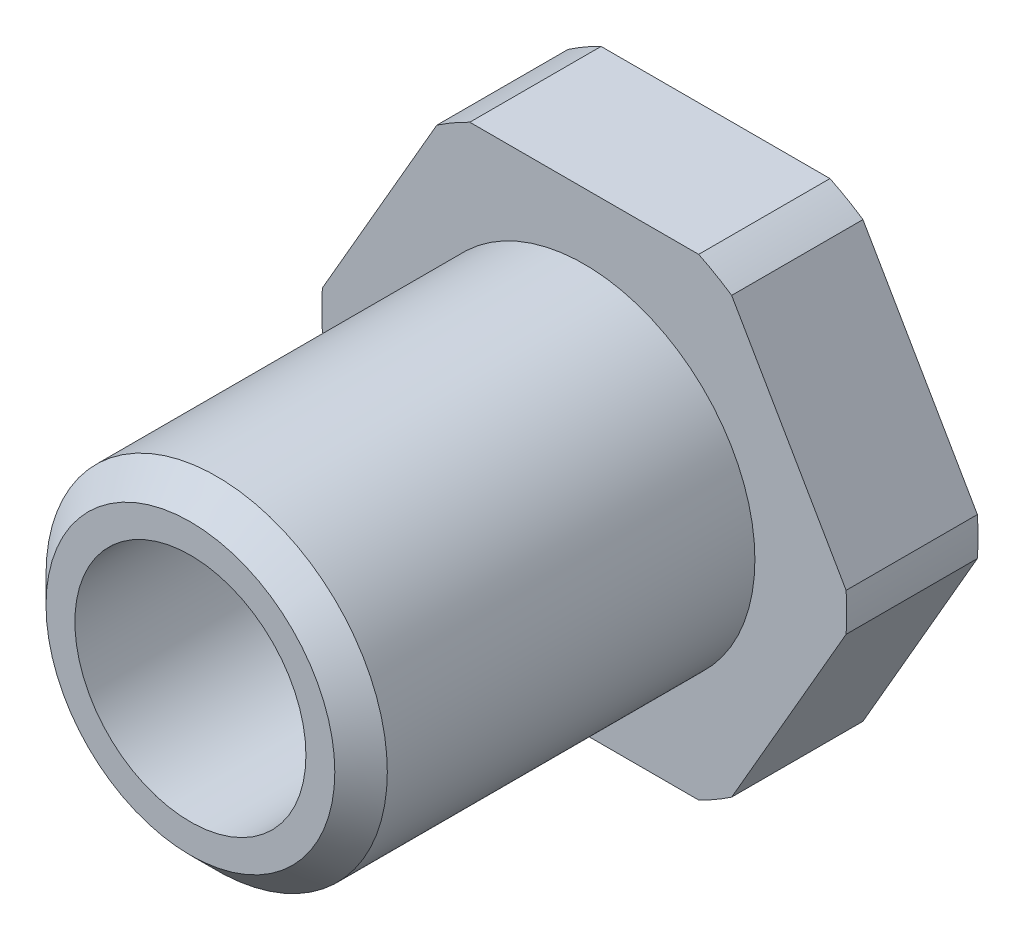
ISO-10303-21;
HEADER;
FILE_DESCRIPTION(('STEP AP214'),'2;1');
FILE_NAME('part.step','',(''),(''),'','','');
FILE_SCHEMA(('AUTOMOTIVE_DESIGN { 1 0 10303 214 1 1 1 1 }'));
ENDSEC;
DATA;
#1=APPLICATION_CONTEXT('core data for automotive mechanical design processes');
#2=APPLICATION_PROTOCOL_DEFINITION('international standard','automotive_design',2000,#1);
#3=PRODUCT_CONTEXT('',#1,'mechanical');
#4=PRODUCT('Part','Part','',(#3));
#5=PRODUCT_RELATED_PRODUCT_CATEGORY('part','',(#4));
#6=PRODUCT_DEFINITION_FORMATION('','',#4);
#7=PRODUCT_DEFINITION_CONTEXT('part definition',#1,'design');
#8=PRODUCT_DEFINITION('design','',#6,#7);
#9=PRODUCT_DEFINITION_SHAPE('','',#8);
#10=(LENGTH_UNIT() NAMED_UNIT(*) SI_UNIT(.MILLI.,.METRE.));
#11=(NAMED_UNIT(*) PLANE_ANGLE_UNIT() SI_UNIT($,.RADIAN.));
#12=(NAMED_UNIT(*) SI_UNIT($,.STERADIAN.) SOLID_ANGLE_UNIT());
#13=UNCERTAINTY_MEASURE_WITH_UNIT(LENGTH_MEASURE(1.E-05),#10,'distance_accuracy_value','');
#14=(GEOMETRIC_REPRESENTATION_CONTEXT(3) GLOBAL_UNCERTAINTY_ASSIGNED_CONTEXT((#13)) GLOBAL_UNIT_ASSIGNED_CONTEXT((#10,
#11,#12)) REPRESENTATION_CONTEXT('',''));
#15=CARTESIAN_POINT('',(0.,0.,0.));
#16=DIRECTION('',(0.,0.,1.));
#17=DIRECTION('',(1.,0.,0.));
#18=AXIS2_PLACEMENT_3D('',#15,#16,#17);
#19=CARTESIAN_POINT('',(10.3923048454133,0.,5.));
#20=DIRECTION('',(0.,0.,1.));
#21=DIRECTION('',(1.,0.,0.));
#22=AXIS2_PLACEMENT_3D('',#19,#20,#21);
#23=PLANE('',#22);
#24=CARTESIAN_POINT('',(0.,0.,5.));
#25=DIRECTION('',(0.,0.,1.));
#26=DIRECTION('',(1.,0.,0.));
#27=AXIS2_PLACEMENT_3D('',#24,#25,#26);
#28=CIRCLE('',#27,6.5);
#29=CARTESIAN_POINT('',(6.5,0.,5.));
#30=VERTEX_POINT('',#29);
#31=EDGE_CURVE('E154',#30,#30,#28,.T.);
#32=ORIENTED_EDGE('',*,*,#31,.F.);
#33=EDGE_LOOP('',(#32));
#34=FACE_BOUND('',#33,.T.);
#35=DIRECTION('',(-0.5,0.866025403784438,0.));
#36=VECTOR('',#35,1.);
#37=CARTESIAN_POINT('',(10.3923048454133,0.,5.));
#38=LINE('',#37,#36);
#39=CARTESIAN_POINT('',(9.97367810583028,0.72508278236463,5.));
#40=VERTEX_POINT('',#39);
#41=CARTESIAN_POINT('',(5.61477916228961,8.27491721763537,5.));
#42=VERTEX_POINT('',#41);
#43=EDGE_CURVE('E144',#40,#42,#38,.T.);
#44=ORIENTED_EDGE('',*,*,#43,.T.);
#45=CARTESIAN_POINT('',(0.,0.,5.));
#46=DIRECTION('',(0.,0.,1.));
#47=DIRECTION('',(1.,0.,0.));
#48=AXIS2_PLACEMENT_3D('',#45,#46,#47);
#49=CIRCLE('',#48,10.);
#50=CARTESIAN_POINT('',(4.35889894354067,9.,5.));
#51=VERTEX_POINT('',#50);
#52=EDGE_CURVE('E217',#42,#51,#49,.T.);
#53=ORIENTED_EDGE('',*,*,#52,.T.);
#54=DIRECTION('',(-1.,0.,0.));
#55=VECTOR('',#54,1.);
#56=CARTESIAN_POINT('',(5.19615242270663,9.,5.));
#57=LINE('',#56,#55);
#58=CARTESIAN_POINT('',(-4.35889894354067,9.,5.));
#59=VERTEX_POINT('',#58);
#60=EDGE_CURVE('E200',#51,#59,#57,.T.);
#61=ORIENTED_EDGE('',*,*,#60,.T.);
#62=CARTESIAN_POINT('',(-5.61477916228962,8.27491721763537,5.));
#63=VERTEX_POINT('',#62);
#64=EDGE_CURVE('E222',#59,#63,#49,.T.);
#65=ORIENTED_EDGE('',*,*,#64,.T.);
#66=DIRECTION('',(-0.5,-0.866025403784439,0.));
#67=VECTOR('',#66,1.);
#68=CARTESIAN_POINT('',(-5.19615242270663,9.,5.));
#69=LINE('',#68,#67);
#70=CARTESIAN_POINT('',(-9.97367810583028,0.725082782364628,5.));
#71=VERTEX_POINT('',#70);
#72=EDGE_CURVE('E203',#63,#71,#69,.T.);
#73=ORIENTED_EDGE('',*,*,#72,.T.);
#74=CARTESIAN_POINT('',(-9.97367810583028,-0.725082782364632,5.));
#75=VERTEX_POINT('',#74);
#76=EDGE_CURVE('E250',#71,#75,#49,.T.);
#77=ORIENTED_EDGE('',*,*,#76,.T.);
#78=DIRECTION('',(0.5,-0.866025403784439,0.));
#79=VECTOR('',#78,1.);
#80=CARTESIAN_POINT('',(-10.3923048454133,0.,5.));
#81=LINE('',#80,#79);
#82=CARTESIAN_POINT('',(-5.61477916228961,-8.27491721763537,5.));
#83=VERTEX_POINT('',#82);
#84=EDGE_CURVE('E206',#75,#83,#81,.T.);
#85=ORIENTED_EDGE('',*,*,#84,.T.);
#86=CARTESIAN_POINT('',(-4.35889894354067,-9.00000000000001,5.));
#87=VERTEX_POINT('',#86);
#88=EDGE_CURVE('E213',#83,#87,#49,.T.);
#89=ORIENTED_EDGE('',*,*,#88,.T.);
#90=DIRECTION('',(1.,0.,0.));
#91=VECTOR('',#90,1.);
#92=CARTESIAN_POINT('',(-5.19615242270663,-9.00000000000001,5.));
#93=LINE('',#92,#91);
#94=CARTESIAN_POINT('',(4.35889894354067,-9.,5.));
#95=VERTEX_POINT('',#94);
#96=EDGE_CURVE('E135',#87,#95,#93,.T.);
#97=ORIENTED_EDGE('',*,*,#96,.T.);
#98=CARTESIAN_POINT('',(5.61477916228962,-8.27491721763537,5.));
#99=VERTEX_POINT('',#98);
#100=EDGE_CURVE('E212',#95,#99,#49,.T.);
#101=ORIENTED_EDGE('',*,*,#100,.T.);
#102=DIRECTION('',(0.5,0.866025403784439,0.));
#103=VECTOR('',#102,1.);
#104=CARTESIAN_POINT('',(5.19615242270664,-9.,5.));
#105=LINE('',#104,#103);
#106=CARTESIAN_POINT('',(9.97367810583028,-0.725082782364636,5.));
#107=VERTEX_POINT('',#106);
#108=EDGE_CURVE('E165',#99,#107,#105,.T.);
#109=ORIENTED_EDGE('',*,*,#108,.T.);
#110=EDGE_CURVE('E224',#107,#40,#49,.T.);
#111=ORIENTED_EDGE('',*,*,#110,.T.);
#112=EDGE_LOOP('',(#44,#53,#61,#65,#73,#77,#85,#89,#97,#101,#109,#111));
#113=FACE_BOUND('',#112,.T.);
#114=ADVANCED_FACE('F35',(#34,#113),#23,.T.);
#115=CARTESIAN_POINT('',(5.19615242270664,-9.,5.));
#116=DIRECTION('',(-0.866025403784439,0.5,0.));
#117=DIRECTION('',(-0.5,-0.866025403784439,0.));
#118=AXIS2_PLACEMENT_3D('',#115,#116,#117);
#119=PLANE('',#118);
#120=DIRECTION('',(0.,0.,1.));
#121=VECTOR('',#120,1.);
#122=CARTESIAN_POINT('',(5.61477916228962,-8.27491721763537,0.));
#123=LINE('',#122,#121);
#124=CARTESIAN_POINT('',(5.61477916228962,-8.27491721763537,0.));
#125=VERTEX_POINT('',#124);
#126=EDGE_CURVE('E184',#125,#99,#123,.T.);
#127=ORIENTED_EDGE('',*,*,#126,.F.);
#128=DIRECTION('',(0.5,0.866025403784439,0.));
#129=VECTOR('',#128,1.);
#130=CARTESIAN_POINT('',(5.19615242270664,-9.,0.));
#131=LINE('',#130,#129);
#132=CARTESIAN_POINT('',(9.97367810583028,-0.725082782364633,0.));
#133=VERTEX_POINT('',#132);
#134=EDGE_CURVE('E149',#125,#133,#131,.T.);
#135=ORIENTED_EDGE('',*,*,#134,.T.);
#136=DIRECTION('',(0.,0.,1.));
#137=VECTOR('',#136,1.);
#138=CARTESIAN_POINT('',(9.97367810583028,-0.725082782364636,0.));
#139=LINE('',#138,#137);
#140=EDGE_CURVE('E129',#107,#133,#139,.F.);
#141=ORIENTED_EDGE('',*,*,#140,.F.);
#142=ORIENTED_EDGE('',*,*,#108,.F.);
#143=EDGE_LOOP('',(#127,#135,#141,#142));
#144=FACE_BOUND('',#143,.T.);
#145=ADVANCED_FACE('F191',(#144),#119,.F.);
#146=CARTESIAN_POINT('',(10.3923048454133,0.,5.));
#147=DIRECTION('',(-0.866025403784438,-0.5,0.));
#148=DIRECTION('',(0.5,-0.866025403784439,0.));
#149=AXIS2_PLACEMENT_3D('',#146,#147,#148);
#150=PLANE('',#149);
#151=DIRECTION('',(0.,0.,1.));
#152=VECTOR('',#151,1.);
#153=CARTESIAN_POINT('',(9.97367810583028,0.72508278236463,0.));
#154=LINE('',#153,#152);
#155=CARTESIAN_POINT('',(9.97367810583028,0.72508278236463,0.));
#156=VERTEX_POINT('',#155);
#157=EDGE_CURVE('E126',#156,#40,#154,.T.);
#158=ORIENTED_EDGE('',*,*,#157,.F.);
#159=DIRECTION('',(-0.5,0.866025403784438,0.));
#160=VECTOR('',#159,1.);
#161=CARTESIAN_POINT('',(10.3923048454133,0.,0.));
#162=LINE('',#161,#160);
#163=CARTESIAN_POINT('',(5.61477916228961,8.27491721763537,0.));
#164=VERTEX_POINT('',#163);
#165=EDGE_CURVE('E142',#156,#164,#162,.T.);
#166=ORIENTED_EDGE('',*,*,#165,.T.);
#167=DIRECTION('',(0.,0.,1.));
#168=VECTOR('',#167,1.);
#169=CARTESIAN_POINT('',(5.61477916228961,8.27491721763537,0.));
#170=LINE('',#169,#168);
#171=EDGE_CURVE('E50',#42,#164,#170,.F.);
#172=ORIENTED_EDGE('',*,*,#171,.F.);
#173=ORIENTED_EDGE('',*,*,#43,.F.);
#174=EDGE_LOOP('',(#158,#166,#172,#173));
#175=FACE_BOUND('',#174,.T.);
#176=ADVANCED_FACE('F141',(#175),#150,.F.);
#177=CARTESIAN_POINT('',(5.19615242270663,9.,5.));
#178=DIRECTION('',(0.,-1.,0.));
#179=DIRECTION('',(1.,0.,0.));
#180=AXIS2_PLACEMENT_3D('',#177,#178,#179);
#181=PLANE('',#180);
#182=DIRECTION('',(0.,0.,1.));
#183=VECTOR('',#182,1.);
#184=CARTESIAN_POINT('',(4.35889894354067,9.,0.));
#185=LINE('',#184,#183);
#186=CARTESIAN_POINT('',(4.35889894354067,9.,0.));
#187=VERTEX_POINT('',#186);
#188=EDGE_CURVE('E235',#187,#51,#185,.T.);
#189=ORIENTED_EDGE('',*,*,#188,.F.);
#190=DIRECTION('',(-1.,0.,0.));
#191=VECTOR('',#190,1.);
#192=CARTESIAN_POINT('',(5.19615242270663,9.,0.));
#193=LINE('',#192,#191);
#194=CARTESIAN_POINT('',(-4.35889894354067,9.,0.));
#195=VERTEX_POINT('',#194);
#196=EDGE_CURVE('E148',#187,#195,#193,.T.);
#197=ORIENTED_EDGE('',*,*,#196,.T.);
#198=DIRECTION('',(0.,0.,1.));
#199=VECTOR('',#198,1.);
#200=CARTESIAN_POINT('',(-4.35889894354067,9.,0.));
#201=LINE('',#200,#199);
#202=EDGE_CURVE('E58',#59,#195,#201,.F.);
#203=ORIENTED_EDGE('',*,*,#202,.F.);
#204=ORIENTED_EDGE('',*,*,#60,.F.);
#205=EDGE_LOOP('',(#189,#197,#203,#204));
#206=FACE_BOUND('',#205,.T.);
#207=ADVANCED_FACE('F241',(#206),#181,.F.);
#208=CARTESIAN_POINT('',(-5.19615242270663,9.,5.));
#209=DIRECTION('',(0.866025403784439,-0.5,0.));
#210=DIRECTION('',(0.5,0.866025403784439,0.));
#211=AXIS2_PLACEMENT_3D('',#208,#209,#210);
#212=PLANE('',#211);
#213=DIRECTION('',(0.,0.,1.));
#214=VECTOR('',#213,1.);
#215=CARTESIAN_POINT('',(-5.61477916228962,8.27491721763537,0.));
#216=LINE('',#215,#214);
#217=CARTESIAN_POINT('',(-5.61477916228961,8.27491721763537,0.));
#218=VERTEX_POINT('',#217);
#219=EDGE_CURVE('E232',#218,#63,#216,.T.);
#220=ORIENTED_EDGE('',*,*,#219,.F.);
#221=DIRECTION('',(-0.5,-0.866025403784439,0.));
#222=VECTOR('',#221,1.);
#223=CARTESIAN_POINT('',(-5.19615242270663,9.,0.));
#224=LINE('',#223,#222);
#225=CARTESIAN_POINT('',(-9.97367810583028,0.725082782364626,0.));
#226=VERTEX_POINT('',#225);
#227=EDGE_CURVE('E152',#218,#226,#224,.T.);
#228=ORIENTED_EDGE('',*,*,#227,.T.);
#229=DIRECTION('',(0.,0.,1.));
#230=VECTOR('',#229,1.);
#231=CARTESIAN_POINT('',(-9.97367810583028,0.725082782364628,0.));
#232=LINE('',#231,#230);
#233=EDGE_CURVE('E230',#71,#226,#232,.F.);
#234=ORIENTED_EDGE('',*,*,#233,.F.);
#235=ORIENTED_EDGE('',*,*,#72,.F.);
#236=EDGE_LOOP('',(#220,#228,#234,#235));
#237=FACE_BOUND('',#236,.T.);
#238=ADVANCED_FACE('F246',(#237),#212,.F.);
#239=CARTESIAN_POINT('',(-10.3923048454133,0.,5.));
#240=DIRECTION('',(0.866025403784439,0.5,0.));
#241=DIRECTION('',(-0.5,0.866025403784439,0.));
#242=AXIS2_PLACEMENT_3D('',#239,#240,#241);
#243=PLANE('',#242);
#244=DIRECTION('',(0.,0.,1.));
#245=VECTOR('',#244,1.);
#246=CARTESIAN_POINT('',(-9.97367810583028,-0.725082782364632,0.));
#247=LINE('',#246,#245);
#248=CARTESIAN_POINT('',(-9.97367810583028,-0.725082782364631,0.));
#249=VERTEX_POINT('',#248);
#250=EDGE_CURVE('E228',#249,#75,#247,.T.);
#251=ORIENTED_EDGE('',*,*,#250,.F.);
#252=DIRECTION('',(0.5,-0.866025403784439,0.));
#253=VECTOR('',#252,1.);
#254=CARTESIAN_POINT('',(-10.3923048454133,0.,0.));
#255=LINE('',#254,#253);
#256=CARTESIAN_POINT('',(-5.61477916228962,-8.27491721763537,0.));
#257=VERTEX_POINT('',#256);
#258=EDGE_CURVE('E160',#249,#257,#255,.T.);
#259=ORIENTED_EDGE('',*,*,#258,.T.);
#260=DIRECTION('',(0.,0.,1.));
#261=VECTOR('',#260,1.);
#262=CARTESIAN_POINT('',(-5.61477916228961,-8.27491721763537,0.));
#263=LINE('',#262,#261);
#264=EDGE_CURVE('E219',#83,#257,#263,.F.);
#265=ORIENTED_EDGE('',*,*,#264,.F.);
#266=ORIENTED_EDGE('',*,*,#84,.F.);
#267=EDGE_LOOP('',(#251,#259,#265,#266));
#268=FACE_BOUND('',#267,.T.);
#269=ADVANCED_FACE('F286',(#268),#243,.F.);
#270=CARTESIAN_POINT('',(-5.19615242270663,-9.00000000000001,5.));
#271=DIRECTION('',(0.,1.,0.));
#272=DIRECTION('',(-1.,0.,0.));
#273=AXIS2_PLACEMENT_3D('',#270,#271,#272);
#274=PLANE('',#273);
#275=DIRECTION('',(0.,0.,1.));
#276=VECTOR('',#275,1.);
#277=CARTESIAN_POINT('',(-4.35889894354067,-9.00000000000001,0.));
#278=LINE('',#277,#276);
#279=CARTESIAN_POINT('',(-4.35889894354067,-9.00000000000001,0.));
#280=VERTEX_POINT('',#279);
#281=EDGE_CURVE('E216',#280,#87,#278,.T.);
#282=ORIENTED_EDGE('',*,*,#281,.F.);
#283=DIRECTION('',(1.,0.,0.));
#284=VECTOR('',#283,1.);
#285=CARTESIAN_POINT('',(-5.19615242270663,-9.00000000000001,0.));
#286=LINE('',#285,#284);
#287=CARTESIAN_POINT('',(4.35889894354067,-9.,0.));
#288=VERTEX_POINT('',#287);
#289=EDGE_CURVE('E163',#280,#288,#286,.T.);
#290=ORIENTED_EDGE('',*,*,#289,.T.);
#291=DIRECTION('',(0.,0.,1.));
#292=VECTOR('',#291,1.);
#293=CARTESIAN_POINT('',(4.35889894354067,-9.,0.));
#294=LINE('',#293,#292);
#295=EDGE_CURVE('E187',#95,#288,#294,.F.);
#296=ORIENTED_EDGE('',*,*,#295,.F.);
#297=ORIENTED_EDGE('',*,*,#96,.F.);
#298=EDGE_LOOP('',(#282,#290,#296,#297));
#299=FACE_BOUND('',#298,.T.);
#300=ADVANCED_FACE('F215',(#299),#274,.F.);
#301=CARTESIAN_POINT('',(10.3923048454133,0.,0.));
#302=DIRECTION('',(0.,0.,1.));
#303=DIRECTION('',(1.,0.,0.));
#304=AXIS2_PLACEMENT_3D('',#301,#302,#303);
#305=PLANE('',#304);
#306=CARTESIAN_POINT('',(0.,0.,0.));
#307=DIRECTION('',(0.,0.,1.));
#308=DIRECTION('',(1.,0.,0.));
#309=AXIS2_PLACEMENT_3D('',#306,#307,#308);
#310=CIRCLE('',#309,4.39999999999999);
#311=CARTESIAN_POINT('',(4.39999999999999,0.,0.));
#312=VERTEX_POINT('',#311);
#313=EDGE_CURVE('E252',#312,#312,#310,.T.);
#314=ORIENTED_EDGE('',*,*,#313,.T.);
#315=EDGE_LOOP('',(#314));
#316=FACE_BOUND('',#315,.T.);
#317=CARTESIAN_POINT('',(0.,0.,0.));
#318=DIRECTION('',(0.,0.,1.));
#319=DIRECTION('',(1.,0.,0.));
#320=AXIS2_PLACEMENT_3D('',#317,#318,#319);
#321=CIRCLE('',#320,10.);
#322=EDGE_CURVE('E137',#164,#187,#321,.T.);
#323=ORIENTED_EDGE('',*,*,#322,.F.);
#324=ORIENTED_EDGE('',*,*,#165,.F.);
#325=EDGE_CURVE('E123',#133,#156,#321,.T.);
#326=ORIENTED_EDGE('',*,*,#325,.F.);
#327=ORIENTED_EDGE('',*,*,#134,.F.);
#328=EDGE_CURVE('E134',#288,#125,#321,.T.);
#329=ORIENTED_EDGE('',*,*,#328,.F.);
#330=ORIENTED_EDGE('',*,*,#289,.F.);
#331=EDGE_CURVE('E173',#257,#280,#321,.T.);
#332=ORIENTED_EDGE('',*,*,#331,.F.);
#333=ORIENTED_EDGE('',*,*,#258,.F.);
#334=EDGE_CURVE('E171',#226,#249,#321,.T.);
#335=ORIENTED_EDGE('',*,*,#334,.F.);
#336=ORIENTED_EDGE('',*,*,#227,.F.);
#337=EDGE_CURVE('E169',#195,#218,#321,.T.);
#338=ORIENTED_EDGE('',*,*,#337,.F.);
#339=ORIENTED_EDGE('',*,*,#196,.F.);
#340=EDGE_LOOP('',(#323,#324,#326,#327,#329,#330,#332,#333,#335,#336,#338,#339));
#341=FACE_BOUND('',#340,.T.);
#342=ADVANCED_FACE('F146',(#316,#341),#305,.F.);
#343=CARTESIAN_POINT('',(0.,0.,20.));
#344=DIRECTION('',(0.,0.,-1.));
#345=DIRECTION('',(-1.,0.,0.));
#346=AXIS2_PLACEMENT_3D('',#343,#344,#345);
#347=CYLINDRICAL_SURFACE('',#346,6.5);
#348=CARTESIAN_POINT('',(0.,0.,19.));
#349=DIRECTION('',(0.,0.,1.));
#350=DIRECTION('',(1.,0.,0.));
#351=AXIS2_PLACEMENT_3D('',#348,#349,#350);
#352=CIRCLE('',#351,6.5);
#353=CARTESIAN_POINT('',(6.5,0.,19.));
#354=VERTEX_POINT('',#353);
#355=EDGE_CURVE('E12',#354,#354,#352,.F.);
#356=ORIENTED_EDGE('',*,*,#355,.T.);
#357=EDGE_LOOP('',(#356));
#358=FACE_BOUND('',#357,.T.);
#359=ORIENTED_EDGE('',*,*,#31,.T.);
#360=EDGE_LOOP('',(#359));
#361=FACE_BOUND('',#360,.T.);
#362=ADVANCED_FACE('F265',(#358,#361),#347,.T.);
#363=CARTESIAN_POINT('',(0.,0.,20.));
#364=DIRECTION('',(0.,0.,1.));
#365=DIRECTION('',(1.,0.,0.));
#366=AXIS2_PLACEMENT_3D('',#363,#364,#365);
#367=PLANE('',#366);
#368=CARTESIAN_POINT('',(0.,0.,20.));
#369=DIRECTION('',(0.,0.,1.));
#370=DIRECTION('',(1.,0.,0.));
#371=AXIS2_PLACEMENT_3D('',#368,#369,#370);
#372=CIRCLE('',#371,4.39999999999999);
#373=CARTESIAN_POINT('',(4.39999999999999,0.,20.));
#374=VERTEX_POINT('',#373);
#375=EDGE_CURVE('E254',#374,#374,#372,.T.);
#376=ORIENTED_EDGE('',*,*,#375,.F.);
#377=EDGE_LOOP('',(#376));
#378=FACE_BOUND('',#377,.T.);
#379=CARTESIAN_POINT('',(0.,0.,20.));
#380=DIRECTION('',(0.,0.,1.));
#381=DIRECTION('',(1.,0.,0.));
#382=AXIS2_PLACEMENT_3D('',#379,#380,#381);
#383=CIRCLE('',#382,5.49999999999999);
#384=CARTESIAN_POINT('',(5.49999999999999,0.,20.));
#385=VERTEX_POINT('',#384);
#386=EDGE_CURVE('E43',#385,#385,#383,.T.);
#387=ORIENTED_EDGE('',*,*,#386,.T.);
#388=EDGE_LOOP('',(#387));
#389=FACE_BOUND('',#388,.T.);
#390=ADVANCED_FACE('F263',(#378,#389),#367,.T.);
#391=CARTESIAN_POINT('',(0.,0.,0.));
#392=DIRECTION('',(0.,0.,1.));
#393=DIRECTION('',(1.,0.,0.));
#394=AXIS2_PLACEMENT_3D('',#391,#392,#393);
#395=CYLINDRICAL_SURFACE('',#394,10.);
#396=ORIENTED_EDGE('',*,*,#140,.T.);
#397=ORIENTED_EDGE('',*,*,#325,.T.);
#398=ORIENTED_EDGE('',*,*,#157,.T.);
#399=ORIENTED_EDGE('',*,*,#110,.F.);
#400=EDGE_LOOP('',(#396,#397,#398,#399));
#401=FACE_BOUND('',#400,.T.);
#402=ADVANCED_FACE('F125',(#401),#395,.T.);
#403=ORIENTED_EDGE('',*,*,#126,.T.);
#404=ORIENTED_EDGE('',*,*,#100,.F.);
#405=ORIENTED_EDGE('',*,*,#295,.T.);
#406=ORIENTED_EDGE('',*,*,#328,.T.);
#407=EDGE_LOOP('',(#403,#404,#405,#406));
#408=FACE_BOUND('',#407,.T.);
#409=ADVANCED_FACE('F183',(#408),#395,.T.);
#410=ORIENTED_EDGE('',*,*,#264,.T.);
#411=ORIENTED_EDGE('',*,*,#331,.T.);
#412=ORIENTED_EDGE('',*,*,#281,.T.);
#413=ORIENTED_EDGE('',*,*,#88,.F.);
#414=EDGE_LOOP('',(#410,#411,#412,#413));
#415=FACE_BOUND('',#414,.T.);
#416=ADVANCED_FACE('F388',(#415),#395,.T.);
#417=ORIENTED_EDGE('',*,*,#233,.T.);
#418=ORIENTED_EDGE('',*,*,#334,.T.);
#419=ORIENTED_EDGE('',*,*,#250,.T.);
#420=ORIENTED_EDGE('',*,*,#76,.F.);
#421=EDGE_LOOP('',(#417,#418,#419,#420));
#422=FACE_BOUND('',#421,.T.);
#423=ADVANCED_FACE('F395',(#422),#395,.T.);
#424=ORIENTED_EDGE('',*,*,#202,.T.);
#425=ORIENTED_EDGE('',*,*,#337,.T.);
#426=ORIENTED_EDGE('',*,*,#219,.T.);
#427=ORIENTED_EDGE('',*,*,#64,.F.);
#428=EDGE_LOOP('',(#424,#425,#426,#427));
#429=FACE_BOUND('',#428,.T.);
#430=ADVANCED_FACE('F248',(#429),#395,.T.);
#431=ORIENTED_EDGE('',*,*,#171,.T.);
#432=ORIENTED_EDGE('',*,*,#322,.T.);
#433=ORIENTED_EDGE('',*,*,#188,.T.);
#434=ORIENTED_EDGE('',*,*,#52,.F.);
#435=EDGE_LOOP('',(#431,#432,#433,#434));
#436=FACE_BOUND('',#435,.T.);
#437=ADVANCED_FACE('F237',(#436),#395,.T.);
#438=CARTESIAN_POINT('',(0.,0.,20.));
#439=DIRECTION('',(0.,0.,-1.));
#440=DIRECTION('',(-1.,0.,0.));
#441=AXIS2_PLACEMENT_3D('',#438,#439,#440);
#442=CONICAL_SURFACE('',#441,5.49999999999999,0.785398163397446);
#443=ORIENTED_EDGE('',*,*,#355,.F.);
#444=EDGE_LOOP('',(#443));
#445=FACE_BOUND('',#444,.T.);
#446=ORIENTED_EDGE('',*,*,#386,.F.);
#447=EDGE_LOOP('',(#446));
#448=FACE_BOUND('',#447,.T.);
#449=ADVANCED_FACE('F37',(#445,#448),#442,.T.);
#450=CARTESIAN_POINT('',(0.,0.,20.));
#451=DIRECTION('',(0.,0.,1.));
#452=DIRECTION('',(1.,0.,0.));
#453=AXIS2_PLACEMENT_3D('',#450,#451,#452);
#454=CYLINDRICAL_SURFACE('',#453,4.39999999999999);
#455=ORIENTED_EDGE('',*,*,#313,.F.);
#456=EDGE_LOOP('',(#455));
#457=FACE_BOUND('',#456,.T.);
#458=ORIENTED_EDGE('',*,*,#375,.T.);
#459=EDGE_LOOP('',(#458));
#460=FACE_BOUND('',#459,.T.);
#461=ADVANCED_FACE('F261',(#457,#460),#454,.F.);
#462=CLOSED_SHELL('',(#114,#145,#176,#207,#238,#269,#300,#342,#362,#390,#402,#409,#416,#423,
#430,#437,#449,#461));
#463=MANIFOLD_SOLID_BREP('B2',#462);
#464=ADVANCED_BREP_SHAPE_REPRESENTATION('',(#18,#463),#14);
#465=SHAPE_DEFINITION_REPRESENTATION(#9,#464);
ENDSEC;
END-ISO-10303-21;
